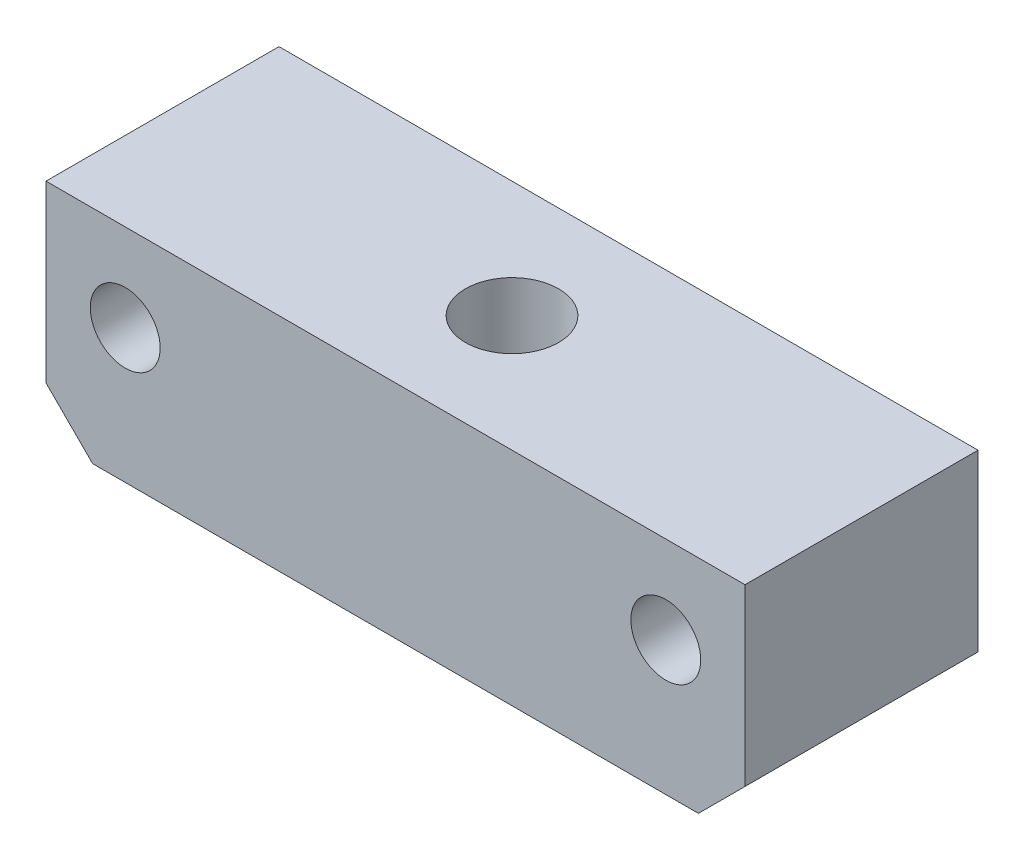
ISO-10303-21;
HEADER;
FILE_DESCRIPTION(('STEP AP214'),'2;1');
FILE_NAME('part.step','',(''),(''),'','','');
FILE_SCHEMA(('AUTOMOTIVE_DESIGN { 1 0 10303 214 1 1 1 1 }'));
ENDSEC;
DATA;
#1=APPLICATION_CONTEXT('core data for automotive mechanical design processes');
#2=APPLICATION_PROTOCOL_DEFINITION('international standard','automotive_design',2000,#1);
#3=PRODUCT_CONTEXT('',#1,'mechanical');
#4=PRODUCT('Part','Part','',(#3));
#5=PRODUCT_RELATED_PRODUCT_CATEGORY('part','',(#4));
#6=PRODUCT_DEFINITION_FORMATION('','',#4);
#7=PRODUCT_DEFINITION_CONTEXT('part definition',#1,'design');
#8=PRODUCT_DEFINITION('design','',#6,#7);
#9=PRODUCT_DEFINITION_SHAPE('','',#8);
#10=(LENGTH_UNIT() NAMED_UNIT(*) SI_UNIT(.MILLI.,.METRE.));
#11=(NAMED_UNIT(*) PLANE_ANGLE_UNIT() SI_UNIT($,.RADIAN.));
#12=(NAMED_UNIT(*) SI_UNIT($,.STERADIAN.) SOLID_ANGLE_UNIT());
#13=UNCERTAINTY_MEASURE_WITH_UNIT(LENGTH_MEASURE(1.E-05),#10,'distance_accuracy_value','');
#14=(GEOMETRIC_REPRESENTATION_CONTEXT(3) GLOBAL_UNCERTAINTY_ASSIGNED_CONTEXT((#13)) GLOBAL_UNIT_ASSIGNED_CONTEXT((#10,
#11,#12)) REPRESENTATION_CONTEXT('',''));
#15=CARTESIAN_POINT('',(0.,0.,0.));
#16=DIRECTION('',(0.,0.,1.));
#17=DIRECTION('',(1.,0.,0.));
#18=AXIS2_PLACEMENT_3D('',#15,#16,#17);
#19=CARTESIAN_POINT('',(0.,0.,10.));
#20=DIRECTION('',(0.,0.,1.));
#21=DIRECTION('',(1.,0.,0.));
#22=AXIS2_PLACEMENT_3D('',#19,#20,#21);
#23=PLANE('',#22);
#24=CARTESIAN_POINT('',(11.6,-1.24999999999999,10.));
#25=DIRECTION('',(0.,0.,1.));
#26=DIRECTION('',(1.,0.,0.));
#27=AXIS2_PLACEMENT_3D('',#24,#25,#26);
#28=CIRCLE('',#27,1.49999999999978);
#29=CARTESIAN_POINT('',(13.0999999999997,-1.24999999999999,10.));
#30=VERTEX_POINT('',#29);
#31=EDGE_CURVE('E129',#30,#30,#28,.T.);
#32=ORIENTED_EDGE('',*,*,#31,.F.);
#33=EDGE_LOOP('',(#32));
#34=FACE_BOUND('',#33,.T.);
#35=DIRECTION('',(-1.,0.,0.));
#36=VECTOR('',#35,1.);
#37=CARTESIAN_POINT('',(14.9999999999998,2.5,10.));
#38=LINE('',#37,#36);
#39=CARTESIAN_POINT('',(14.9999999999998,2.5,10.));
#40=VERTEX_POINT('',#39);
#41=CARTESIAN_POINT('',(-15.0000000000002,2.5,10.));
#42=VERTEX_POINT('',#41);
#43=EDGE_CURVE('E136',#40,#42,#38,.T.);
#44=ORIENTED_EDGE('',*,*,#43,.T.);
#45=DIRECTION('',(0.,-1.,0.));
#46=VECTOR('',#45,1.);
#47=CARTESIAN_POINT('',(-15.0000000000002,2.5,10.));
#48=LINE('',#47,#46);
#49=CARTESIAN_POINT('',(-15.0000000000002,-4.99999999999998,10.));
#50=VERTEX_POINT('',#49);
#51=EDGE_CURVE('E94',#42,#50,#48,.T.);
#52=ORIENTED_EDGE('',*,*,#51,.T.);
#53=DIRECTION('',(0.707106781186546,-0.707106781186549,0.));
#54=VECTOR('',#53,1.);
#55=CARTESIAN_POINT('',(-15.0000000000002,-4.99999999999998,10.));
#56=LINE('',#55,#54);
#57=CARTESIAN_POINT('',(-13.0000000000002,-7.,10.));
#58=VERTEX_POINT('',#57);
#59=EDGE_CURVE('E107',#50,#58,#56,.T.);
#60=ORIENTED_EDGE('',*,*,#59,.T.);
#61=DIRECTION('',(1.,0.,0.));
#62=VECTOR('',#61,1.);
#63=CARTESIAN_POINT('',(-13.0000000000002,-7.,10.));
#64=LINE('',#63,#62);
#65=CARTESIAN_POINT('',(12.9999999999998,-7.,10.));
#66=VERTEX_POINT('',#65);
#67=EDGE_CURVE('E101',#58,#66,#64,.T.);
#68=ORIENTED_EDGE('',*,*,#67,.T.);
#69=DIRECTION('',(0.707106781186546,0.707106781186549,0.));
#70=VECTOR('',#69,1.);
#71=CARTESIAN_POINT('',(12.9999999999998,-7.,10.));
#72=LINE('',#71,#70);
#73=CARTESIAN_POINT('',(14.9999999999998,-5.,10.));
#74=VERTEX_POINT('',#73);
#75=EDGE_CURVE('E105',#66,#74,#72,.T.);
#76=ORIENTED_EDGE('',*,*,#75,.T.);
#77=DIRECTION('',(0.,1.,0.));
#78=VECTOR('',#77,1.);
#79=CARTESIAN_POINT('',(14.9999999999998,-5.,10.));
#80=LINE('',#79,#78);
#81=EDGE_CURVE('E57',#74,#40,#80,.T.);
#82=ORIENTED_EDGE('',*,*,#81,.T.);
#83=EDGE_LOOP('',(#44,#52,#60,#68,#76,#82));
#84=FACE_BOUND('',#83,.T.);
#85=CARTESIAN_POINT('',(-11.6,-1.24999999999999,10.));
#86=DIRECTION('',(0.,0.,1.));
#87=DIRECTION('',(1.,0.,0.));
#88=AXIS2_PLACEMENT_3D('',#85,#86,#87);
#89=CIRCLE('',#88,1.49999999999978);
#90=CARTESIAN_POINT('',(-10.1000000000002,-1.24999999999999,10.));
#91=VERTEX_POINT('',#90);
#92=EDGE_CURVE('E195',#91,#91,#89,.T.);
#93=ORIENTED_EDGE('',*,*,#92,.F.);
#94=EDGE_LOOP('',(#93));
#95=FACE_BOUND('',#94,.T.);
#96=ADVANCED_FACE('F39',(#34,#84,#95),#23,.T.);
#97=CARTESIAN_POINT('',(0.,0.,0.));
#98=DIRECTION('',(0.,0.,1.));
#99=DIRECTION('',(1.,0.,0.));
#100=AXIS2_PLACEMENT_3D('',#97,#98,#99);
#101=PLANE('',#100);
#102=DIRECTION('',(-1.,0.,0.));
#103=VECTOR('',#102,1.);
#104=CARTESIAN_POINT('',(14.9999999999998,2.5,0.));
#105=LINE('',#104,#103);
#106=CARTESIAN_POINT('',(14.9999999999998,2.5,0.));
#107=VERTEX_POINT('',#106);
#108=CARTESIAN_POINT('',(-15.0000000000002,2.5,0.));
#109=VERTEX_POINT('',#108);
#110=EDGE_CURVE('E125',#107,#109,#105,.T.);
#111=ORIENTED_EDGE('',*,*,#110,.F.);
#112=DIRECTION('',(0.,1.,0.));
#113=VECTOR('',#112,1.);
#114=CARTESIAN_POINT('',(14.9999999999998,-5.,0.));
#115=LINE('',#114,#113);
#116=CARTESIAN_POINT('',(14.9999999999998,-5.,0.));
#117=VERTEX_POINT('',#116);
#118=EDGE_CURVE('E86',#117,#107,#115,.T.);
#119=ORIENTED_EDGE('',*,*,#118,.F.);
#120=DIRECTION('',(0.707106781186546,0.707106781186549,0.));
#121=VECTOR('',#120,1.);
#122=CARTESIAN_POINT('',(12.9999999999998,-7.,0.));
#123=LINE('',#122,#121);
#124=CARTESIAN_POINT('',(12.9999999999998,-7.,0.));
#125=VERTEX_POINT('',#124);
#126=EDGE_CURVE('E80',#125,#117,#123,.T.);
#127=ORIENTED_EDGE('',*,*,#126,.F.);
#128=DIRECTION('',(1.,0.,0.));
#129=VECTOR('',#128,1.);
#130=CARTESIAN_POINT('',(-13.0000000000002,-7.,0.));
#131=LINE('',#130,#129);
#132=CARTESIAN_POINT('',(-13.0000000000002,-7.,0.));
#133=VERTEX_POINT('',#132);
#134=EDGE_CURVE('E115',#133,#125,#131,.T.);
#135=ORIENTED_EDGE('',*,*,#134,.F.);
#136=DIRECTION('',(0.707106781186546,-0.707106781186549,0.));
#137=VECTOR('',#136,1.);
#138=CARTESIAN_POINT('',(-15.0000000000002,-4.99999999999998,0.));
#139=LINE('',#138,#137);
#140=CARTESIAN_POINT('',(-15.0000000000002,-4.99999999999998,0.));
#141=VERTEX_POINT('',#140);
#142=EDGE_CURVE('E131',#141,#133,#139,.T.);
#143=ORIENTED_EDGE('',*,*,#142,.F.);
#144=DIRECTION('',(0.,-1.,0.));
#145=VECTOR('',#144,1.);
#146=CARTESIAN_POINT('',(-15.0000000000002,2.5,0.));
#147=LINE('',#146,#145);
#148=EDGE_CURVE('E128',#109,#141,#147,.T.);
#149=ORIENTED_EDGE('',*,*,#148,.F.);
#150=EDGE_LOOP('',(#111,#119,#127,#135,#143,#149));
#151=FACE_BOUND('',#150,.T.);
#152=CARTESIAN_POINT('',(11.6,-1.24999999999999,0.));
#153=DIRECTION('',(0.,0.,1.));
#154=DIRECTION('',(1.,0.,0.));
#155=AXIS2_PLACEMENT_3D('',#152,#153,#154);
#156=CIRCLE('',#155,1.49999999999978);
#157=CARTESIAN_POINT('',(13.0999999999997,-1.24999999999999,0.));
#158=VERTEX_POINT('',#157);
#159=EDGE_CURVE('E198',#158,#158,#156,.T.);
#160=ORIENTED_EDGE('',*,*,#159,.T.);
#161=EDGE_LOOP('',(#160));
#162=FACE_BOUND('',#161,.T.);
#163=CARTESIAN_POINT('',(-11.6,-1.24999999999999,0.));
#164=DIRECTION('',(0.,0.,1.));
#165=DIRECTION('',(1.,0.,0.));
#166=AXIS2_PLACEMENT_3D('',#163,#164,#165);
#167=CIRCLE('',#166,1.49999999999978);
#168=CARTESIAN_POINT('',(-10.1000000000002,-1.24999999999999,0.));
#169=VERTEX_POINT('',#168);
#170=EDGE_CURVE('E199',#169,#169,#167,.T.);
#171=ORIENTED_EDGE('',*,*,#170,.T.);
#172=EDGE_LOOP('',(#171));
#173=FACE_BOUND('',#172,.T.);
#174=ADVANCED_FACE('F146',(#151,#162,#173),#101,.F.);
#175=CARTESIAN_POINT('',(14.9999999999998,2.5,10.));
#176=DIRECTION('',(0.,-1.,0.));
#177=DIRECTION('',(0.,0.,-1.));
#178=AXIS2_PLACEMENT_3D('',#175,#176,#177);
#179=PLANE('',#178);
#180=CARTESIAN_POINT('',(-2.22044604925031E-13,2.5,5.));
#181=DIRECTION('',(0.,-1.,0.));
#182=DIRECTION('',(0.,0.,-1.));
#183=AXIS2_PLACEMENT_3D('',#180,#181,#182);
#184=CIRCLE('',#183,1.99999999999999);
#185=CARTESIAN_POINT('',(-2.22044604925031E-13,2.5,3.00000000000001));
#186=VERTEX_POINT('',#185);
#187=EDGE_CURVE('E43',#186,#186,#184,.T.);
#188=ORIENTED_EDGE('',*,*,#187,.T.);
#189=EDGE_LOOP('',(#188));
#190=FACE_BOUND('',#189,.T.);
#191=ORIENTED_EDGE('',*,*,#110,.T.);
#192=DIRECTION('',(0.,0.,-1.));
#193=VECTOR('',#192,1.);
#194=CARTESIAN_POINT('',(-15.0000000000002,2.5,10.));
#195=LINE('',#194,#193);
#196=EDGE_CURVE('E11',#42,#109,#195,.T.);
#197=ORIENTED_EDGE('',*,*,#196,.F.);
#198=ORIENTED_EDGE('',*,*,#43,.F.);
#199=DIRECTION('',(0.,0.,-1.));
#200=VECTOR('',#199,1.);
#201=CARTESIAN_POINT('',(14.9999999999998,2.5,10.));
#202=LINE('',#201,#200);
#203=EDGE_CURVE('E121',#40,#107,#202,.T.);
#204=ORIENTED_EDGE('',*,*,#203,.T.);
#205=EDGE_LOOP('',(#191,#197,#198,#204));
#206=FACE_BOUND('',#205,.T.);
#207=ADVANCED_FACE('F41',(#190,#206),#179,.F.);
#208=CARTESIAN_POINT('',(-15.0000000000002,2.5,10.));
#209=DIRECTION('',(1.,0.,0.));
#210=DIRECTION('',(0.,0.,-1.));
#211=AXIS2_PLACEMENT_3D('',#208,#209,#210);
#212=PLANE('',#211);
#213=ORIENTED_EDGE('',*,*,#148,.T.);
#214=DIRECTION('',(0.,0.,-1.));
#215=VECTOR('',#214,1.);
#216=CARTESIAN_POINT('',(-15.0000000000002,-4.99999999999998,10.));
#217=LINE('',#216,#215);
#218=EDGE_CURVE('E49',#50,#141,#217,.T.);
#219=ORIENTED_EDGE('',*,*,#218,.F.);
#220=ORIENTED_EDGE('',*,*,#51,.F.);
#221=ORIENTED_EDGE('',*,*,#196,.T.);
#222=EDGE_LOOP('',(#213,#219,#220,#221));
#223=FACE_BOUND('',#222,.T.);
#224=ADVANCED_FACE('F217',(#223),#212,.F.);
#225=CARTESIAN_POINT('',(-15.0000000000002,-4.99999999999998,10.));
#226=DIRECTION('',(0.707106781186549,0.707106781186546,0.));
#227=DIRECTION('',(-0.707106781186546,0.707106781186549,0.));
#228=AXIS2_PLACEMENT_3D('',#225,#226,#227);
#229=PLANE('',#228);
#230=ORIENTED_EDGE('',*,*,#142,.T.);
#231=DIRECTION('',(0.,0.,-1.));
#232=VECTOR('',#231,1.);
#233=CARTESIAN_POINT('',(-13.0000000000002,-7.,10.));
#234=LINE('',#233,#232);
#235=EDGE_CURVE('E116',#58,#133,#234,.T.);
#236=ORIENTED_EDGE('',*,*,#235,.F.);
#237=ORIENTED_EDGE('',*,*,#59,.F.);
#238=ORIENTED_EDGE('',*,*,#218,.T.);
#239=EDGE_LOOP('',(#230,#236,#237,#238));
#240=FACE_BOUND('',#239,.T.);
#241=ADVANCED_FACE('F143',(#240),#229,.F.);
#242=CARTESIAN_POINT('',(-13.0000000000002,-7.,10.));
#243=DIRECTION('',(0.,1.,0.));
#244=DIRECTION('',(0.,0.,1.));
#245=AXIS2_PLACEMENT_3D('',#242,#243,#244);
#246=PLANE('',#245);
#247=CARTESIAN_POINT('',(-2.22044604925031E-13,-7.00000000000001,5.));
#248=DIRECTION('',(0.,-1.,0.));
#249=DIRECTION('',(0.,0.,-1.));
#250=AXIS2_PLACEMENT_3D('',#247,#248,#249);
#251=CIRCLE('',#250,3.95);
#252=CARTESIAN_POINT('',(-2.22044604925031E-13,-7.00000000000001,1.05));
#253=VERTEX_POINT('',#252);
#254=EDGE_CURVE('E190',#253,#253,#251,.T.);
#255=ORIENTED_EDGE('',*,*,#254,.F.);
#256=EDGE_LOOP('',(#255));
#257=FACE_BOUND('',#256,.T.);
#258=ORIENTED_EDGE('',*,*,#134,.T.);
#259=DIRECTION('',(0.,0.,-1.));
#260=VECTOR('',#259,1.);
#261=CARTESIAN_POINT('',(12.9999999999998,-7.,10.));
#262=LINE('',#261,#260);
#263=EDGE_CURVE('E112',#66,#125,#262,.T.);
#264=ORIENTED_EDGE('',*,*,#263,.F.);
#265=ORIENTED_EDGE('',*,*,#67,.F.);
#266=ORIENTED_EDGE('',*,*,#235,.T.);
#267=EDGE_LOOP('',(#258,#264,#265,#266));
#268=FACE_BOUND('',#267,.T.);
#269=ADVANCED_FACE('F113',(#257,#268),#246,.F.);
#270=CARTESIAN_POINT('',(12.9999999999998,-7.,10.));
#271=DIRECTION('',(-0.707106781186549,0.707106781186546,0.));
#272=DIRECTION('',(-0.707106781186546,-0.707106781186549,0.));
#273=AXIS2_PLACEMENT_3D('',#270,#271,#272);
#274=PLANE('',#273);
#275=ORIENTED_EDGE('',*,*,#126,.T.);
#276=DIRECTION('',(0.,0.,-1.));
#277=VECTOR('',#276,1.);
#278=CARTESIAN_POINT('',(14.9999999999998,-5.,10.));
#279=LINE('',#278,#277);
#280=EDGE_CURVE('E117',#74,#117,#279,.T.);
#281=ORIENTED_EDGE('',*,*,#280,.F.);
#282=ORIENTED_EDGE('',*,*,#75,.F.);
#283=ORIENTED_EDGE('',*,*,#263,.T.);
#284=EDGE_LOOP('',(#275,#281,#282,#283));
#285=FACE_BOUND('',#284,.T.);
#286=ADVANCED_FACE('F119',(#285),#274,.F.);
#287=CARTESIAN_POINT('',(14.9999999999998,-5.,10.));
#288=DIRECTION('',(-1.,0.,0.));
#289=DIRECTION('',(0.,-1.,0.));
#290=AXIS2_PLACEMENT_3D('',#287,#288,#289);
#291=PLANE('',#290);
#292=ORIENTED_EDGE('',*,*,#118,.T.);
#293=ORIENTED_EDGE('',*,*,#203,.F.);
#294=ORIENTED_EDGE('',*,*,#81,.F.);
#295=ORIENTED_EDGE('',*,*,#280,.T.);
#296=EDGE_LOOP('',(#292,#293,#294,#295));
#297=FACE_BOUND('',#296,.T.);
#298=ADVANCED_FACE('F151',(#297),#291,.F.);
#299=CARTESIAN_POINT('',(11.6,-1.24999999999999,10.));
#300=DIRECTION('',(0.,0.,-1.));
#301=DIRECTION('',(-1.,0.,0.));
#302=AXIS2_PLACEMENT_3D('',#299,#300,#301);
#303=CYLINDRICAL_SURFACE('',#302,1.49999999999978);
#304=ORIENTED_EDGE('',*,*,#31,.T.);
#305=EDGE_LOOP('',(#304));
#306=FACE_BOUND('',#305,.T.);
#307=ORIENTED_EDGE('',*,*,#159,.F.);
#308=EDGE_LOOP('',(#307));
#309=FACE_BOUND('',#308,.T.);
#310=ADVANCED_FACE('F153',(#306,#309),#303,.F.);
#311=CARTESIAN_POINT('',(-11.6,-1.24999999999999,10.));
#312=DIRECTION('',(0.,0.,-1.));
#313=DIRECTION('',(-1.,0.,0.));
#314=AXIS2_PLACEMENT_3D('',#311,#312,#313);
#315=CYLINDRICAL_SURFACE('',#314,1.49999999999978);
#316=ORIENTED_EDGE('',*,*,#92,.T.);
#317=EDGE_LOOP('',(#316));
#318=FACE_BOUND('',#317,.T.);
#319=ORIENTED_EDGE('',*,*,#170,.F.);
#320=EDGE_LOOP('',(#319));
#321=FACE_BOUND('',#320,.T.);
#322=ADVANCED_FACE('F159',(#318,#321),#315,.F.);
#323=CARTESIAN_POINT('',(-2.22044604925031E-13,-7.00000000000001,5.));
#324=DIRECTION('',(0.,-1.,0.));
#325=DIRECTION('',(0.,0.,-1.));
#326=AXIS2_PLACEMENT_3D('',#323,#324,#325);
#327=CYLINDRICAL_SURFACE('',#326,1.99999999999999);
#328=CARTESIAN_POINT('',(-2.22044604925031E-13,-5.05,5.));
#329=DIRECTION('',(0.,-1.,0.));
#330=DIRECTION('',(0.,0.,-1.));
#331=AXIS2_PLACEMENT_3D('',#328,#329,#330);
#332=CIRCLE('',#331,2.);
#333=CARTESIAN_POINT('',(-2.22044604925031E-13,-5.05,3.00000000000001));
#334=VERTEX_POINT('',#333);
#335=EDGE_CURVE('E187',#334,#334,#332,.T.);
#336=ORIENTED_EDGE('',*,*,#335,.T.);
#337=EDGE_LOOP('',(#336));
#338=FACE_BOUND('',#337,.T.);
#339=ORIENTED_EDGE('',*,*,#187,.F.);
#340=EDGE_LOOP('',(#339));
#341=FACE_BOUND('',#340,.T.);
#342=ADVANCED_FACE('F174',(#338,#341),#327,.F.);
#343=CARTESIAN_POINT('',(-2.22044604925031E-13,-7.00000000000001,5.));
#344=DIRECTION('',(0.,-1.,0.));
#345=DIRECTION('',(0.,0.,-1.));
#346=AXIS2_PLACEMENT_3D('',#343,#344,#345);
#347=CONICAL_SURFACE('',#346,3.95,0.785398163397447);
#348=ORIENTED_EDGE('',*,*,#335,.F.);
#349=EDGE_LOOP('',(#348));
#350=FACE_BOUND('',#349,.T.);
#351=ORIENTED_EDGE('',*,*,#254,.T.);
#352=EDGE_LOOP('',(#351));
#353=FACE_BOUND('',#352,.T.);
#354=ADVANCED_FACE('F178',(#350,#353),#347,.F.);
#355=CLOSED_SHELL('',(#96,#174,#207,#224,#241,#269,#286,#298,#310,#322,#342,#354));
#356=MANIFOLD_SOLID_BREP('B2',#355);
#357=ADVANCED_BREP_SHAPE_REPRESENTATION('',(#18,#356),#14);
#358=SHAPE_DEFINITION_REPRESENTATION(#9,#357);
ENDSEC;
END-ISO-10303-21;
